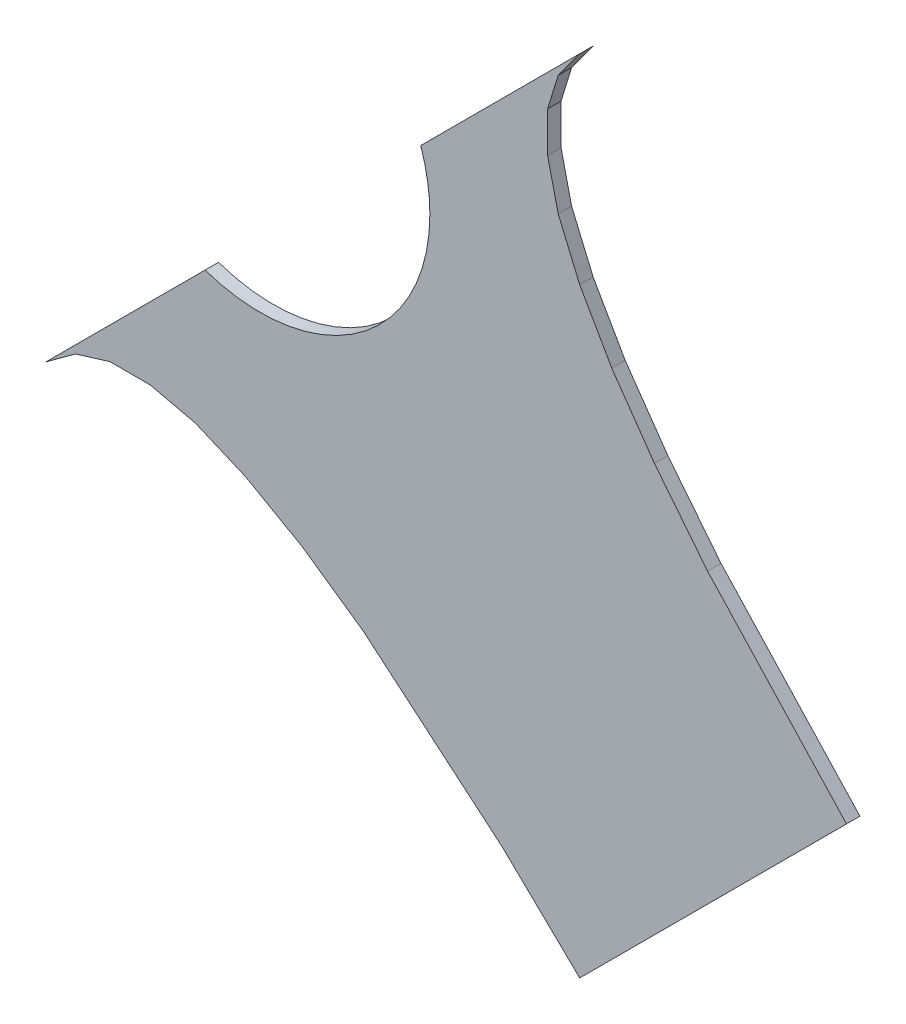
ISO-10303-21;
HEADER;
FILE_DESCRIPTION(('STEP AP214'),'2;1');
FILE_NAME('part.step','',(''),(''),'','','');
FILE_SCHEMA(('AUTOMOTIVE_DESIGN { 1 0 10303 214 1 1 1 1 }'));
ENDSEC;
DATA;
#1=APPLICATION_CONTEXT('core data for automotive mechanical design processes');
#2=APPLICATION_PROTOCOL_DEFINITION('international standard','automotive_design',2000,#1);
#3=PRODUCT_CONTEXT('',#1,'mechanical');
#4=PRODUCT('Part','Part','',(#3));
#5=PRODUCT_RELATED_PRODUCT_CATEGORY('part','',(#4));
#6=PRODUCT_DEFINITION_FORMATION('','',#4);
#7=PRODUCT_DEFINITION_CONTEXT('part definition',#1,'design');
#8=PRODUCT_DEFINITION('design','',#6,#7);
#9=PRODUCT_DEFINITION_SHAPE('','',#8);
#10=(LENGTH_UNIT() NAMED_UNIT(*) SI_UNIT(.MILLI.,.METRE.));
#11=(NAMED_UNIT(*) PLANE_ANGLE_UNIT() SI_UNIT($,.RADIAN.));
#12=(NAMED_UNIT(*) SI_UNIT($,.STERADIAN.) SOLID_ANGLE_UNIT());
#13=UNCERTAINTY_MEASURE_WITH_UNIT(LENGTH_MEASURE(1.E-05),#10,'distance_accuracy_value','');
#14=(GEOMETRIC_REPRESENTATION_CONTEXT(3) GLOBAL_UNCERTAINTY_ASSIGNED_CONTEXT((#13)) GLOBAL_UNIT_ASSIGNED_CONTEXT((#10,
#11,#12)) REPRESENTATION_CONTEXT('',''));
#15=CARTESIAN_POINT('',(0.,0.,0.));
#16=DIRECTION('',(0.,0.,1.));
#17=DIRECTION('',(1.,0.,0.));
#18=AXIS2_PLACEMENT_3D('',#15,#16,#17);
#19=CARTESIAN_POINT('',(46.8470001220703,61.0460014343262,0.));
#20=DIRECTION('',(-0.707104873544097,0.707108688823852,0.));
#21=DIRECTION('',(0.707108688823852,0.707104873544097,0.));
#22=AXIS2_PLACEMENT_3D('',#19,#20,#21);
#23=PLANE('',#22);
#24=DIRECTION('',(0.707108688823852,0.707104873544096,0.));
#25=VECTOR('',#24,1.);
#26=CARTESIAN_POINT('',(46.8470001220703,61.0460014343262,0.03556));
#27=LINE('',#26,#25);
#28=CARTESIAN_POINT('',(46.8470001220703,61.0460014343262,0.03556));
#29=VERTEX_POINT('',#28);
#30=CARTESIAN_POINT('',(47.5540008544922,61.7529983520508,0.03556));
#31=VERTEX_POINT('',#30);
#32=EDGE_CURVE('E11',#29,#31,#27,.T.);
#33=ORIENTED_EDGE('',*,*,#32,.F.);
#34=DIRECTION('',(0.,0.,1.));
#35=VECTOR('',#34,1.);
#36=CARTESIAN_POINT('',(46.8470001220703,61.0460014343262,0.));
#37=LINE('',#36,#35);
#38=CARTESIAN_POINT('',(46.8470001220703,61.0460014343262,0.));
#39=VERTEX_POINT('',#38);
#40=EDGE_CURVE('E24',#39,#29,#37,.T.);
#41=ORIENTED_EDGE('',*,*,#40,.F.);
#42=DIRECTION('',(0.707108688823852,0.707104873544096,0.));
#43=VECTOR('',#42,1.);
#44=CARTESIAN_POINT('',(46.8470001220703,61.0460014343262,0.));
#45=LINE('',#44,#43);
#46=CARTESIAN_POINT('',(47.5540008544922,61.7529983520508,0.));
#47=VERTEX_POINT('',#46);
#48=EDGE_CURVE('E351',#39,#47,#45,.T.);
#49=ORIENTED_EDGE('',*,*,#48,.T.);
#50=DIRECTION('',(0.,0.,1.));
#51=VECTOR('',#50,1.);
#52=CARTESIAN_POINT('',(47.5540008544922,61.7529983520508,0.));
#53=LINE('',#52,#51);
#54=EDGE_CURVE('E37',#47,#31,#53,.T.);
#55=ORIENTED_EDGE('',*,*,#54,.T.);
#56=EDGE_LOOP('',(#33,#41,#49,#55));
#57=FACE_BOUND('',#56,.T.);
#58=ADVANCED_FACE('F17',(#57),#23,.F.);
#59=CARTESIAN_POINT('',(46.6419982910156,61.2439994812012,0.));
#60=DIRECTION('',(0.694712980419731,0.71928706010628,0.));
#61=DIRECTION('',(0.71928706010628,-0.694712980419731,0.));
#62=AXIS2_PLACEMENT_3D('',#59,#60,#61);
#63=PLANE('',#62);
#64=DIRECTION('',(0.71928706010628,-0.694712980419731,0.));
#65=VECTOR('',#64,1.);
#66=CARTESIAN_POINT('',(46.6419982910156,61.2439994812012,0.03556));
#67=LINE('',#66,#65);
#68=CARTESIAN_POINT('',(46.6419982910156,61.2439994812012,0.03556));
#69=VERTEX_POINT('',#68);
#70=EDGE_CURVE('E347',#69,#29,#67,.T.);
#71=ORIENTED_EDGE('',*,*,#70,.F.);
#72=DIRECTION('',(0.,0.,1.));
#73=VECTOR('',#72,1.);
#74=CARTESIAN_POINT('',(46.6419982910156,61.2439994812012,0.));
#75=LINE('',#74,#73);
#76=CARTESIAN_POINT('',(46.6419982910156,61.2439994812012,0.));
#77=VERTEX_POINT('',#76);
#78=EDGE_CURVE('E345',#77,#69,#75,.T.);
#79=ORIENTED_EDGE('',*,*,#78,.F.);
#80=DIRECTION('',(0.71928706010628,-0.694712980419731,0.));
#81=VECTOR('',#80,1.);
#82=CARTESIAN_POINT('',(46.6419982910156,61.2439994812012,0.));
#83=LINE('',#82,#81);
#84=EDGE_CURVE('E343',#77,#39,#83,.T.);
#85=ORIENTED_EDGE('',*,*,#84,.T.);
#86=ORIENTED_EDGE('',*,*,#40,.T.);
#87=EDGE_LOOP('',(#71,#79,#85,#86));
#88=FACE_BOUND('',#87,.T.);
#89=ADVANCED_FACE('F354',(#88),#63,.F.);
#90=CARTESIAN_POINT('',(46.273998260498,61.5550003051758,0.));
#91=DIRECTION('',(0.645477892235465,0.76377895404054,0.));
#92=DIRECTION('',(0.76377895404054,-0.645477892235465,0.));
#93=AXIS2_PLACEMENT_3D('',#90,#91,#92);
#94=PLANE('',#93);
#95=DIRECTION('',(0.76377895404054,-0.645477892235465,0.));
#96=VECTOR('',#95,1.);
#97=CARTESIAN_POINT('',(46.273998260498,61.5550003051758,0.03556));
#98=LINE('',#97,#96);
#99=CARTESIAN_POINT('',(46.273998260498,61.5550003051758,0.03556));
#100=VERTEX_POINT('',#99);
#101=EDGE_CURVE('E340',#100,#69,#98,.T.);
#102=ORIENTED_EDGE('',*,*,#101,.F.);
#103=DIRECTION('',(0.,0.,1.));
#104=VECTOR('',#103,1.);
#105=CARTESIAN_POINT('',(46.273998260498,61.5550003051758,0.));
#106=LINE('',#105,#104);
#107=CARTESIAN_POINT('',(46.273998260498,61.5550003051758,0.));
#108=VERTEX_POINT('',#107);
#109=EDGE_CURVE('E338',#108,#100,#106,.T.);
#110=ORIENTED_EDGE('',*,*,#109,.F.);
#111=DIRECTION('',(0.76377895404054,-0.645477892235465,0.));
#112=VECTOR('',#111,1.);
#113=CARTESIAN_POINT('',(46.273998260498,61.5550003051758,0.));
#114=LINE('',#113,#112);
#115=EDGE_CURVE('E335',#108,#77,#114,.T.);
#116=ORIENTED_EDGE('',*,*,#115,.T.);
#117=ORIENTED_EDGE('',*,*,#78,.T.);
#118=EDGE_LOOP('',(#102,#110,#116,#117));
#119=FACE_BOUND('',#118,.T.);
#120=ADVANCED_FACE('F357',(#119),#94,.F.);
#121=CARTESIAN_POINT('',(46.1119995117188,61.6679992675781,0.));
#122=DIRECTION('',(0.572101838559274,0.820182593278532,0.));
#123=DIRECTION('',(0.820182593278532,-0.572101838559274,0.));
#124=AXIS2_PLACEMENT_3D('',#121,#122,#123);
#125=PLANE('',#124);
#126=DIRECTION('',(0.820182593278532,-0.572101838559274,0.));
#127=VECTOR('',#126,1.);
#128=CARTESIAN_POINT('',(46.1119995117188,61.6679992675781,0.03556));
#129=LINE('',#128,#127);
#130=CARTESIAN_POINT('',(46.1119995117188,61.6679992675781,0.03556));
#131=VERTEX_POINT('',#130);
#132=EDGE_CURVE('E332',#131,#100,#129,.T.);
#133=ORIENTED_EDGE('',*,*,#132,.F.);
#134=DIRECTION('',(0.,0.,1.));
#135=VECTOR('',#134,1.);
#136=CARTESIAN_POINT('',(46.1119995117188,61.6679992675781,0.));
#137=LINE('',#136,#135);
#138=CARTESIAN_POINT('',(46.1119995117188,61.6679992675781,0.));
#139=VERTEX_POINT('',#138);
#140=EDGE_CURVE('E330',#139,#131,#137,.T.);
#141=ORIENTED_EDGE('',*,*,#140,.F.);
#142=DIRECTION('',(0.820182593278532,-0.572101838559274,0.));
#143=VECTOR('',#142,1.);
#144=CARTESIAN_POINT('',(46.1119995117188,61.6679992675781,0.));
#145=LINE('',#144,#143);
#146=EDGE_CURVE('E327',#139,#108,#145,.T.);
#147=ORIENTED_EDGE('',*,*,#146,.T.);
#148=ORIENTED_EDGE('',*,*,#109,.T.);
#149=EDGE_LOOP('',(#133,#141,#147,#148));
#150=FACE_BOUND('',#149,.T.);
#151=ADVANCED_FACE('F362',(#150),#125,.F.);
#152=CARTESIAN_POINT('',(45.9630012512207,61.7529983520508,0.));
#153=DIRECTION('',(0.495511349715486,0.868601463447499,0.));
#154=DIRECTION('',(0.868601463447499,-0.495511349715486,0.));
#155=AXIS2_PLACEMENT_3D('',#152,#153,#154);
#156=PLANE('',#155);
#157=DIRECTION('',(0.868601463447499,-0.495511349715486,0.));
#158=VECTOR('',#157,1.);
#159=CARTESIAN_POINT('',(45.9630012512207,61.7529983520508,0.03556));
#160=LINE('',#159,#158);
#161=CARTESIAN_POINT('',(45.9630012512207,61.7529983520508,0.03556));
#162=VERTEX_POINT('',#161);
#163=EDGE_CURVE('E324',#162,#131,#160,.T.);
#164=ORIENTED_EDGE('',*,*,#163,.F.);
#165=DIRECTION('',(0.,0.,1.));
#166=VECTOR('',#165,1.);
#167=CARTESIAN_POINT('',(45.9630012512207,61.7529983520508,0.));
#168=LINE('',#167,#166);
#169=CARTESIAN_POINT('',(45.9630012512207,61.7529983520508,0.));
#170=VERTEX_POINT('',#169);
#171=EDGE_CURVE('E322',#170,#162,#168,.T.);
#172=ORIENTED_EDGE('',*,*,#171,.F.);
#173=DIRECTION('',(0.868601463447499,-0.495511349715486,0.));
#174=VECTOR('',#173,1.);
#175=CARTESIAN_POINT('',(45.9630012512207,61.7529983520508,0.));
#176=LINE('',#175,#174);
#177=EDGE_CURVE('E319',#170,#139,#176,.T.);
#178=ORIENTED_EDGE('',*,*,#177,.T.);
#179=ORIENTED_EDGE('',*,*,#140,.T.);
#180=EDGE_LOOP('',(#164,#172,#178,#179));
#181=FACE_BOUND('',#180,.T.);
#182=ADVANCED_FACE('F365',(#181),#156,.F.);
#183=CARTESIAN_POINT('',(45.8289985656738,61.810001373291,0.));
#184=DIRECTION('',(0.391442376057666,0.920202622375273,0.));
#185=DIRECTION('',(0.920202622375273,-0.391442376057666,0.));
#186=AXIS2_PLACEMENT_3D('',#183,#184,#185);
#187=PLANE('',#186);
#188=DIRECTION('',(0.920202622375273,-0.391442376057666,0.));
#189=VECTOR('',#188,1.);
#190=CARTESIAN_POINT('',(45.8289985656738,61.810001373291,0.03556));
#191=LINE('',#190,#189);
#192=CARTESIAN_POINT('',(45.8289985656738,61.810001373291,0.03556));
#193=VERTEX_POINT('',#192);
#194=EDGE_CURVE('E316',#193,#162,#191,.T.);
#195=ORIENTED_EDGE('',*,*,#194,.F.);
#196=DIRECTION('',(0.,0.,1.));
#197=VECTOR('',#196,1.);
#198=CARTESIAN_POINT('',(45.8289985656738,61.810001373291,0.));
#199=LINE('',#198,#197);
#200=CARTESIAN_POINT('',(45.8289985656738,61.810001373291,0.));
#201=VERTEX_POINT('',#200);
#202=EDGE_CURVE('E314',#201,#193,#199,.T.);
#203=ORIENTED_EDGE('',*,*,#202,.F.);
#204=DIRECTION('',(0.920202622375273,-0.391442376057666,0.));
#205=VECTOR('',#204,1.);
#206=CARTESIAN_POINT('',(45.8289985656738,61.810001373291,0.));
#207=LINE('',#206,#205);
#208=EDGE_CURVE('E311',#201,#170,#207,.T.);
#209=ORIENTED_EDGE('',*,*,#208,.T.);
#210=ORIENTED_EDGE('',*,*,#171,.T.);
#211=EDGE_LOOP('',(#195,#203,#209,#210));
#212=FACE_BOUND('',#211,.T.);
#213=ADVANCED_FACE('F370',(#212),#187,.F.);
#214=CARTESIAN_POINT('',(45.7089996337891,61.8380012512207,0.));
#215=DIRECTION('',(0.227230594252667,0.973840981390483,0.));
#216=DIRECTION('',(0.973840981390483,-0.227230594252667,0.));
#217=AXIS2_PLACEMENT_3D('',#214,#215,#216);
#218=PLANE('',#217);
#219=DIRECTION('',(0.973840981390483,-0.227230594252667,0.));
#220=VECTOR('',#219,1.);
#221=CARTESIAN_POINT('',(45.7089996337891,61.8380012512207,0.03556));
#222=LINE('',#221,#220);
#223=CARTESIAN_POINT('',(45.7089996337891,61.8380012512207,0.03556));
#224=VERTEX_POINT('',#223);
#225=EDGE_CURVE('E308',#224,#193,#222,.T.);
#226=ORIENTED_EDGE('',*,*,#225,.F.);
#227=DIRECTION('',(0.,0.,1.));
#228=VECTOR('',#227,1.);
#229=CARTESIAN_POINT('',(45.7089996337891,61.8380012512207,0.));
#230=LINE('',#229,#228);
#231=CARTESIAN_POINT('',(45.7089996337891,61.8380012512207,0.));
#232=VERTEX_POINT('',#231);
#233=EDGE_CURVE('E306',#232,#224,#230,.T.);
#234=ORIENTED_EDGE('',*,*,#233,.F.);
#235=DIRECTION('',(0.973840981390483,-0.227230594252667,0.));
#236=VECTOR('',#235,1.);
#237=CARTESIAN_POINT('',(45.7089996337891,61.8380012512207,0.));
#238=LINE('',#237,#236);
#239=EDGE_CURVE('E303',#232,#201,#238,.T.);
#240=ORIENTED_EDGE('',*,*,#239,.T.);
#241=ORIENTED_EDGE('',*,*,#202,.T.);
#242=EDGE_LOOP('',(#226,#234,#240,#241));
#243=FACE_BOUND('',#242,.T.);
#244=ADVANCED_FACE('F373',(#243),#218,.F.);
#245=CARTESIAN_POINT('',(45.6020011901855,61.8380012512207,0.));
#246=DIRECTION('',(0.,1.,0.));
#247=DIRECTION('',(1.,0.,0.));
#248=AXIS2_PLACEMENT_3D('',#245,#246,#247);
#249=PLANE('',#248);
#250=DIRECTION('',(1.,0.,0.));
#251=VECTOR('',#250,1.);
#252=CARTESIAN_POINT('',(45.6020011901855,61.8380012512207,0.03556));
#253=LINE('',#252,#251);
#254=CARTESIAN_POINT('',(45.6020011901855,61.8380012512207,0.03556));
#255=VERTEX_POINT('',#254);
#256=EDGE_CURVE('E300',#255,#224,#253,.T.);
#257=ORIENTED_EDGE('',*,*,#256,.F.);
#258=DIRECTION('',(0.,0.,1.));
#259=VECTOR('',#258,1.);
#260=CARTESIAN_POINT('',(45.6020011901855,61.8380012512207,0.));
#261=LINE('',#260,#259);
#262=CARTESIAN_POINT('',(45.6020011901855,61.8380012512207,0.));
#263=VERTEX_POINT('',#262);
#264=EDGE_CURVE('E298',#263,#255,#261,.T.);
#265=ORIENTED_EDGE('',*,*,#264,.F.);
#266=DIRECTION('',(1.,0.,0.));
#267=VECTOR('',#266,1.);
#268=CARTESIAN_POINT('',(45.6020011901855,61.8380012512207,0.));
#269=LINE('',#268,#267);
#270=EDGE_CURVE('E295',#263,#232,#269,.T.);
#271=ORIENTED_EDGE('',*,*,#270,.T.);
#272=ORIENTED_EDGE('',*,*,#233,.T.);
#273=EDGE_LOOP('',(#257,#265,#271,#272));
#274=FACE_BOUND('',#273,.T.);
#275=ADVANCED_FACE('F378',(#274),#249,.F.);
#276=CARTESIAN_POINT('',(45.5110015869141,61.810001373291,0.));
#277=DIRECTION('',(-0.294085848837523,0.95577900872195,0.));
#278=DIRECTION('',(0.95577900872195,0.294085848837523,0.));
#279=AXIS2_PLACEMENT_3D('',#276,#277,#278);
#280=PLANE('',#279);
#281=DIRECTION('',(0.95577900872195,0.294085848837523,0.));
#282=VECTOR('',#281,1.);
#283=CARTESIAN_POINT('',(45.5110015869141,61.810001373291,0.03556));
#284=LINE('',#283,#282);
#285=CARTESIAN_POINT('',(45.5110015869141,61.810001373291,0.03556));
#286=VERTEX_POINT('',#285);
#287=EDGE_CURVE('E292',#286,#255,#284,.T.);
#288=ORIENTED_EDGE('',*,*,#287,.F.);
#289=DIRECTION('',(0.,0.,1.));
#290=VECTOR('',#289,1.);
#291=CARTESIAN_POINT('',(45.5110015869141,61.810001373291,0.));
#292=LINE('',#291,#290);
#293=CARTESIAN_POINT('',(45.5110015869141,61.810001373291,0.));
#294=VERTEX_POINT('',#293);
#295=EDGE_CURVE('E290',#294,#286,#292,.T.);
#296=ORIENTED_EDGE('',*,*,#295,.F.);
#297=DIRECTION('',(0.95577900872195,0.294085848837523,0.));
#298=VECTOR('',#297,1.);
#299=CARTESIAN_POINT('',(45.5110015869141,61.810001373291,0.));
#300=LINE('',#299,#298);
#301=EDGE_CURVE('E287',#294,#263,#300,.T.);
#302=ORIENTED_EDGE('',*,*,#301,.T.);
#303=ORIENTED_EDGE('',*,*,#264,.T.);
#304=EDGE_LOOP('',(#288,#296,#302,#303));
#305=FACE_BOUND('',#304,.T.);
#306=ADVANCED_FACE('F381',(#305),#280,.F.);
#307=CARTESIAN_POINT('',(45.4329986572266,61.7529983520508,0.));
#308=DIRECTION('',(-0.590022529192244,0.807386781564813,0.));
#309=DIRECTION('',(0.807386781564813,0.590022529192244,0.));
#310=AXIS2_PLACEMENT_3D('',#307,#308,#309);
#311=PLANE('',#310);
#312=DIRECTION('',(0.807386781564813,0.590022529192244,0.));
#313=VECTOR('',#312,1.);
#314=CARTESIAN_POINT('',(45.4329986572266,61.7529983520508,0.03556));
#315=LINE('',#314,#313);
#316=CARTESIAN_POINT('',(45.4329986572266,61.7529983520508,0.03556));
#317=VERTEX_POINT('',#316);
#318=EDGE_CURVE('E284',#317,#286,#315,.T.);
#319=ORIENTED_EDGE('',*,*,#318,.F.);
#320=DIRECTION('',(0.,0.,1.));
#321=VECTOR('',#320,1.);
#322=CARTESIAN_POINT('',(45.4329986572266,61.7529983520508,0.));
#323=LINE('',#322,#321);
#324=CARTESIAN_POINT('',(45.4329986572266,61.7529983520508,0.));
#325=VERTEX_POINT('',#324);
#326=EDGE_CURVE('E282',#325,#317,#323,.T.);
#327=ORIENTED_EDGE('',*,*,#326,.F.);
#328=DIRECTION('',(0.807386781564813,0.590022529192244,0.));
#329=VECTOR('',#328,1.);
#330=CARTESIAN_POINT('',(45.4329986572266,61.7529983520508,0.));
#331=LINE('',#330,#329);
#332=EDGE_CURVE('E279',#325,#294,#331,.T.);
#333=ORIENTED_EDGE('',*,*,#332,.T.);
#334=ORIENTED_EDGE('',*,*,#295,.T.);
#335=EDGE_LOOP('',(#319,#327,#333,#334));
#336=FACE_BOUND('',#335,.T.);
#337=ADVANCED_FACE('F386',(#336),#311,.F.);
#338=CARTESIAN_POINT('',(45.8542411622094,62.1742408570336,0.));
#339=DIRECTION('',(0.707106781186548,-0.707106781186548,0.));
#340=DIRECTION('',(-0.707106781186548,-0.707106781186548,0.));
#341=AXIS2_PLACEMENT_3D('',#338,#339,#340);
#342=PLANE('',#341);
#343=DIRECTION('',(-0.707106781186548,-0.707106781186548,0.));
#344=VECTOR('',#343,1.);
#345=CARTESIAN_POINT('',(46.8470001220703,63.1669998168945,0.03556));
#346=LINE('',#345,#344);
#347=CARTESIAN_POINT('',(45.8542411622094,62.1742408570336,0.03556));
#348=VERTEX_POINT('',#347);
#349=EDGE_CURVE('E276',#348,#317,#346,.T.);
#350=ORIENTED_EDGE('',*,*,#349,.F.);
#351=DIRECTION('',(0.,0.,1.));
#352=VECTOR('',#351,1.);
#353=CARTESIAN_POINT('',(45.8542411622094,62.1742408570336,0.));
#354=LINE('',#353,#352);
#355=CARTESIAN_POINT('',(45.8542411622094,62.1742408570336,0.));
#356=VERTEX_POINT('',#355);
#357=EDGE_CURVE('E274',#356,#348,#354,.T.);
#358=ORIENTED_EDGE('',*,*,#357,.F.);
#359=DIRECTION('',(-0.707106781186548,-0.707106781186548,0.));
#360=VECTOR('',#359,1.);
#361=CARTESIAN_POINT('',(46.8470001220703,63.1669998168945,0.));
#362=LINE('',#361,#360);
#363=EDGE_CURVE('E271',#356,#325,#362,.T.);
#364=ORIENTED_EDGE('',*,*,#363,.T.);
#365=ORIENTED_EDGE('',*,*,#326,.T.);
#366=EDGE_LOOP('',(#350,#358,#364,#365));
#367=FACE_BOUND('',#366,.T.);
#368=ADVANCED_FACE('F389',(#367),#342,.F.);
#369=CARTESIAN_POINT('',(46.0000096,62.5999764,0.));
#370=DIRECTION('',(0.,0.,-1.));
#371=DIRECTION('',(1.,0.,0.));
#372=AXIS2_PLACEMENT_3D('',#369,#370,#371);
#373=CYLINDRICAL_SURFACE('',#372,0.4499991);
#374=ORIENTED_EDGE('',*,*,#357,.T.);
#375=CARTESIAN_POINT('',(46.0000096,62.5999764,0.03556));
#376=DIRECTION('',(0.,0.,1.));
#377=DIRECTION('',(1.,0.,0.));
#378=AXIS2_PLACEMENT_3D('',#375,#376,#377);
#379=CIRCLE('',#378,0.4499991);
#380=CARTESIAN_POINT('',(46.4500087,62.5999764,0.03556));
#381=VERTEX_POINT('',#380);
#382=EDGE_CURVE('E268',#348,#381,#379,.T.);
#383=ORIENTED_EDGE('',*,*,#382,.T.);
#384=DIRECTION('',(0.,0.,1.));
#385=VECTOR('',#384,1.);
#386=CARTESIAN_POINT('',(46.4500087,62.5999764,0.));
#387=LINE('',#386,#385);
#388=CARTESIAN_POINT('',(46.4500087,62.5999764,0.));
#389=VERTEX_POINT('',#388);
#390=EDGE_CURVE('E266',#389,#381,#387,.T.);
#391=ORIENTED_EDGE('',*,*,#390,.F.);
#392=CARTESIAN_POINT('',(46.0000096,62.5999764,0.));
#393=DIRECTION('',(0.,0.,1.));
#394=DIRECTION('',(1.,0.,0.));
#395=AXIS2_PLACEMENT_3D('',#392,#393,#394);
#396=CIRCLE('',#395,0.4499991);
#397=EDGE_CURVE('E263',#356,#389,#396,.T.);
#398=ORIENTED_EDGE('',*,*,#397,.F.);
#399=EDGE_LOOP('',(#374,#383,#391,#398));
#400=FACE_BOUND('',#399,.T.);
#401=ADVANCED_FACE('F395',(#400),#373,.F.);
#402=CARTESIAN_POINT('',(46.0000096,62.5999764,0.));
#403=DIRECTION('',(0.,0.,-1.));
#404=DIRECTION('',(1.,0.,0.));
#405=AXIS2_PLACEMENT_3D('',#402,#403,#404);
#406=CYLINDRICAL_SURFACE('',#405,0.4499991);
#407=ORIENTED_EDGE('',*,*,#390,.T.);
#408=CARTESIAN_POINT('',(46.0000096,62.5999764,0.03556));
#409=DIRECTION('',(0.,0.,1.));
#410=DIRECTION('',(1.,0.,0.));
#411=AXIS2_PLACEMENT_3D('',#408,#409,#410);
#412=CIRCLE('',#411,0.4499991);
#413=CARTESIAN_POINT('',(46.4257451429664,62.7457448377906,0.03556));
#414=VERTEX_POINT('',#413);
#415=EDGE_CURVE('E260',#381,#414,#412,.T.);
#416=ORIENTED_EDGE('',*,*,#415,.T.);
#417=DIRECTION('',(0.,0.,1.));
#418=VECTOR('',#417,1.);
#419=CARTESIAN_POINT('',(46.4257451429664,62.7457448377906,0.));
#420=LINE('',#419,#418);
#421=CARTESIAN_POINT('',(46.4257451429664,62.7457448377906,0.));
#422=VERTEX_POINT('',#421);
#423=EDGE_CURVE('E258',#422,#414,#420,.T.);
#424=ORIENTED_EDGE('',*,*,#423,.F.);
#425=EDGE_CURVE('E257',#389,#422,#396,.T.);
#426=ORIENTED_EDGE('',*,*,#425,.F.);
#427=EDGE_LOOP('',(#407,#416,#424,#426));
#428=FACE_BOUND('',#427,.T.);
#429=ADVANCED_FACE('F398',(#428),#406,.F.);
#430=CARTESIAN_POINT('',(46.8470001220703,63.1669998168945,0.));
#431=DIRECTION('',(0.707106781186548,-0.707106781186548,0.));
#432=DIRECTION('',(-0.707106781186548,-0.707106781186548,0.));
#433=AXIS2_PLACEMENT_3D('',#430,#431,#432);
#434=PLANE('',#433);
#435=DIRECTION('',(-0.707106781186548,-0.707106781186548,0.));
#436=VECTOR('',#435,1.);
#437=CARTESIAN_POINT('',(46.8470001220703,63.1669998168945,0.03556));
#438=LINE('',#437,#436);
#439=CARTESIAN_POINT('',(46.8470001220703,63.1669998168945,0.03556));
#440=VERTEX_POINT('',#439);
#441=EDGE_CURVE('E254',#440,#414,#438,.T.);
#442=ORIENTED_EDGE('',*,*,#441,.F.);
#443=DIRECTION('',(0.,0.,1.));
#444=VECTOR('',#443,1.);
#445=CARTESIAN_POINT('',(46.8470001220703,63.1669998168945,0.));
#446=LINE('',#445,#444);
#447=CARTESIAN_POINT('',(46.8470001220703,63.1669998168945,0.));
#448=VERTEX_POINT('',#447);
#449=EDGE_CURVE('E252',#448,#440,#446,.T.);
#450=ORIENTED_EDGE('',*,*,#449,.F.);
#451=EDGE_CURVE('E251',#448,#422,#362,.T.);
#452=ORIENTED_EDGE('',*,*,#451,.T.);
#453=ORIENTED_EDGE('',*,*,#423,.T.);
#454=EDGE_LOOP('',(#442,#450,#452,#453));
#455=FACE_BOUND('',#454,.T.);
#456=ADVANCED_FACE('F404',(#455),#434,.F.);
#457=CARTESIAN_POINT('',(46.7900009155274,63.0890007019043,0.));
#458=DIRECTION('',(-0.807391845742416,0.59001559930959,0.));
#459=DIRECTION('',(0.59001559930959,0.807391845742416,0.));
#460=AXIS2_PLACEMENT_3D('',#457,#458,#459);
#461=PLANE('',#460);
#462=DIRECTION('',(0.59001559930959,0.807391845742416,0.));
#463=VECTOR('',#462,1.);
#464=CARTESIAN_POINT('',(46.7900009155274,63.0890007019043,0.03556));
#465=LINE('',#464,#463);
#466=CARTESIAN_POINT('',(46.7900009155274,63.0890007019043,0.03556));
#467=VERTEX_POINT('',#466);
#468=EDGE_CURVE('E248',#467,#440,#465,.T.);
#469=ORIENTED_EDGE('',*,*,#468,.F.);
#470=DIRECTION('',(0.,0.,1.));
#471=VECTOR('',#470,1.);
#472=CARTESIAN_POINT('',(46.7900009155274,63.0890007019043,0.));
#473=LINE('',#472,#471);
#474=CARTESIAN_POINT('',(46.7900009155274,63.0890007019043,0.));
#475=VERTEX_POINT('',#474);
#476=EDGE_CURVE('E246',#475,#467,#473,.T.);
#477=ORIENTED_EDGE('',*,*,#476,.F.);
#478=DIRECTION('',(0.59001559930959,0.807391845742416,0.));
#479=VECTOR('',#478,1.);
#480=CARTESIAN_POINT('',(46.7900009155274,63.0890007019043,0.));
#481=LINE('',#480,#479);
#482=EDGE_CURVE('E243',#475,#448,#481,.T.);
#483=ORIENTED_EDGE('',*,*,#482,.T.);
#484=ORIENTED_EDGE('',*,*,#449,.T.);
#485=EDGE_LOOP('',(#469,#477,#483,#484));
#486=FACE_BOUND('',#485,.T.);
#487=ADVANCED_FACE('F407',(#486),#461,.F.);
#488=CARTESIAN_POINT('',(46.7620010375977,62.9980010986328,0.));
#489=DIRECTION('',(-0.95577900872195,0.294085848837523,0.));
#490=DIRECTION('',(0.294085848837523,0.95577900872195,0.));
#491=AXIS2_PLACEMENT_3D('',#488,#489,#490);
#492=PLANE('',#491);
#493=DIRECTION('',(0.294085848837523,0.95577900872195,0.));
#494=VECTOR('',#493,1.);
#495=CARTESIAN_POINT('',(46.7620010375977,62.9980010986328,0.03556));
#496=LINE('',#495,#494);
#497=CARTESIAN_POINT('',(46.7620010375977,62.9980010986328,0.03556));
#498=VERTEX_POINT('',#497);
#499=EDGE_CURVE('E240',#498,#467,#496,.T.);
#500=ORIENTED_EDGE('',*,*,#499,.F.);
#501=DIRECTION('',(0.,0.,1.));
#502=VECTOR('',#501,1.);
#503=CARTESIAN_POINT('',(46.7620010375977,62.9980010986328,0.));
#504=LINE('',#503,#502);
#505=CARTESIAN_POINT('',(46.7620010375977,62.9980010986328,0.));
#506=VERTEX_POINT('',#505);
#507=EDGE_CURVE('E238',#506,#498,#504,.T.);
#508=ORIENTED_EDGE('',*,*,#507,.F.);
#509=DIRECTION('',(0.294085848837523,0.95577900872195,0.));
#510=VECTOR('',#509,1.);
#511=CARTESIAN_POINT('',(46.7620010375977,62.9980010986328,0.));
#512=LINE('',#511,#510);
#513=EDGE_CURVE('E235',#506,#475,#512,.T.);
#514=ORIENTED_EDGE('',*,*,#513,.T.);
#515=ORIENTED_EDGE('',*,*,#476,.T.);
#516=EDGE_LOOP('',(#500,#508,#514,#515));
#517=FACE_BOUND('',#516,.T.);
#518=ADVANCED_FACE('F412',(#517),#492,.F.);
#519=CARTESIAN_POINT('',(46.7620010375977,62.890998840332,0.));
#520=DIRECTION('',(-1.,0.,0.));
#521=DIRECTION('',(0.,1.,0.));
#522=AXIS2_PLACEMENT_3D('',#519,#520,#521);
#523=PLANE('',#522);
#524=DIRECTION('',(0.,1.,0.));
#525=VECTOR('',#524,1.);
#526=CARTESIAN_POINT('',(46.7620010375977,62.890998840332,0.03556));
#527=LINE('',#526,#525);
#528=CARTESIAN_POINT('',(46.7620010375977,62.890998840332,0.03556));
#529=VERTEX_POINT('',#528);
#530=EDGE_CURVE('E232',#529,#498,#527,.T.);
#531=ORIENTED_EDGE('',*,*,#530,.F.);
#532=DIRECTION('',(0.,0.,1.));
#533=VECTOR('',#532,1.);
#534=CARTESIAN_POINT('',(46.7620010375977,62.890998840332,0.));
#535=LINE('',#534,#533);
#536=CARTESIAN_POINT('',(46.7620010375977,62.890998840332,0.));
#537=VERTEX_POINT('',#536);
#538=EDGE_CURVE('E230',#537,#529,#535,.T.);
#539=ORIENTED_EDGE('',*,*,#538,.F.);
#540=DIRECTION('',(0.,1.,0.));
#541=VECTOR('',#540,1.);
#542=CARTESIAN_POINT('',(46.7620010375977,62.890998840332,0.));
#543=LINE('',#542,#541);
#544=EDGE_CURVE('E227',#537,#506,#543,.T.);
#545=ORIENTED_EDGE('',*,*,#544,.T.);
#546=ORIENTED_EDGE('',*,*,#507,.T.);
#547=EDGE_LOOP('',(#531,#539,#545,#546));
#548=FACE_BOUND('',#547,.T.);
#549=ADVANCED_FACE('F415',(#548),#523,.F.);
#550=CARTESIAN_POINT('',(46.7900009155274,62.7709999084473,0.));
#551=DIRECTION('',(-0.973840981390483,-0.227230594252667,0.));
#552=DIRECTION('',(-0.227230594252667,0.973840981390483,0.));
#553=AXIS2_PLACEMENT_3D('',#550,#551,#552);
#554=PLANE('',#553);
#555=DIRECTION('',(-0.227230594252667,0.973840981390483,0.));
#556=VECTOR('',#555,1.);
#557=CARTESIAN_POINT('',(46.7900009155274,62.7709999084473,0.03556));
#558=LINE('',#557,#556);
#559=CARTESIAN_POINT('',(46.7900009155274,62.7709999084473,0.03556));
#560=VERTEX_POINT('',#559);
#561=EDGE_CURVE('E224',#560,#529,#558,.T.);
#562=ORIENTED_EDGE('',*,*,#561,.F.);
#563=DIRECTION('',(0.,0.,1.));
#564=VECTOR('',#563,1.);
#565=CARTESIAN_POINT('',(46.7900009155274,62.7709999084473,0.));
#566=LINE('',#565,#564);
#567=CARTESIAN_POINT('',(46.7900009155274,62.7709999084473,0.));
#568=VERTEX_POINT('',#567);
#569=EDGE_CURVE('E222',#568,#560,#566,.T.);
#570=ORIENTED_EDGE('',*,*,#569,.F.);
#571=DIRECTION('',(-0.227230594252667,0.973840981390483,0.));
#572=VECTOR('',#571,1.);
#573=CARTESIAN_POINT('',(46.7900009155274,62.7709999084473,0.));
#574=LINE('',#573,#572);
#575=EDGE_CURVE('E219',#568,#537,#574,.T.);
#576=ORIENTED_EDGE('',*,*,#575,.T.);
#577=ORIENTED_EDGE('',*,*,#538,.T.);
#578=EDGE_LOOP('',(#562,#570,#576,#577));
#579=FACE_BOUND('',#578,.T.);
#580=ADVANCED_FACE('F420',(#579),#554,.F.);
#581=CARTESIAN_POINT('',(46.8470001220703,62.6370010375977,0.));
#582=DIRECTION('',(-0.920208044437893,-0.391429629629373,0.));
#583=DIRECTION('',(-0.391429629629373,0.920208044437893,0.));
#584=AXIS2_PLACEMENT_3D('',#581,#582,#583);
#585=PLANE('',#584);
#586=DIRECTION('',(-0.391429629629373,0.920208044437893,0.));
#587=VECTOR('',#586,1.);
#588=CARTESIAN_POINT('',(46.8470001220703,62.6370010375977,0.03556));
#589=LINE('',#588,#587);
#590=CARTESIAN_POINT('',(46.8470001220703,62.6370010375977,0.03556));
#591=VERTEX_POINT('',#590);
#592=EDGE_CURVE('E216',#591,#560,#589,.T.);
#593=ORIENTED_EDGE('',*,*,#592,.F.);
#594=DIRECTION('',(0.,0.,1.));
#595=VECTOR('',#594,1.);
#596=CARTESIAN_POINT('',(46.8470001220703,62.6370010375977,0.));
#597=LINE('',#596,#595);
#598=CARTESIAN_POINT('',(46.8470001220703,62.6370010375977,0.));
#599=VERTEX_POINT('',#598);
#600=EDGE_CURVE('E214',#599,#591,#597,.T.);
#601=ORIENTED_EDGE('',*,*,#600,.F.);
#602=DIRECTION('',(-0.391429629629373,0.920208044437893,0.));
#603=VECTOR('',#602,1.);
#604=CARTESIAN_POINT('',(46.8470001220703,62.6370010375977,0.));
#605=LINE('',#604,#603);
#606=EDGE_CURVE('E211',#599,#568,#605,.T.);
#607=ORIENTED_EDGE('',*,*,#606,.T.);
#608=ORIENTED_EDGE('',*,*,#569,.T.);
#609=EDGE_LOOP('',(#593,#601,#607,#608));
#610=FACE_BOUND('',#609,.T.);
#611=ADVANCED_FACE('F423',(#610),#585,.F.);
#612=CARTESIAN_POINT('',(46.931999206543,62.4879989624024,0.));
#613=DIRECTION('',(-0.868606923465397,-0.495501778511418,0.));
#614=DIRECTION('',(-0.495501778511418,0.868606923465397,0.));
#615=AXIS2_PLACEMENT_3D('',#612,#613,#614);
#616=PLANE('',#615);
#617=DIRECTION('',(-0.495501778511418,0.868606923465397,0.));
#618=VECTOR('',#617,1.);
#619=CARTESIAN_POINT('',(46.931999206543,62.4879989624023,0.03556));
#620=LINE('',#619,#618);
#621=CARTESIAN_POINT('',(46.931999206543,62.4879989624023,0.03556));
#622=VERTEX_POINT('',#621);
#623=EDGE_CURVE('E208',#622,#591,#620,.T.);
#624=ORIENTED_EDGE('',*,*,#623,.F.);
#625=DIRECTION('',(0.,0.,1.));
#626=VECTOR('',#625,1.);
#627=CARTESIAN_POINT('',(46.931999206543,62.4879989624023,0.));
#628=LINE('',#627,#626);
#629=CARTESIAN_POINT('',(46.931999206543,62.4879989624023,0.));
#630=VERTEX_POINT('',#629);
#631=EDGE_CURVE('E206',#630,#622,#628,.T.);
#632=ORIENTED_EDGE('',*,*,#631,.F.);
#633=DIRECTION('',(-0.495501778511418,0.868606923465397,0.));
#634=VECTOR('',#633,1.);
#635=CARTESIAN_POINT('',(46.931999206543,62.4879989624023,0.));
#636=LINE('',#635,#634);
#637=EDGE_CURVE('E203',#630,#599,#636,.T.);
#638=ORIENTED_EDGE('',*,*,#637,.T.);
#639=ORIENTED_EDGE('',*,*,#600,.T.);
#640=EDGE_LOOP('',(#624,#632,#638,#639));
#641=FACE_BOUND('',#640,.T.);
#642=ADVANCED_FACE('F426',(#641),#616,.F.);
#643=CARTESIAN_POINT('',(47.0449981689453,62.326000213623,0.));
#644=DIRECTION('',(-0.820182593278532,-0.572101838559274,0.));
#645=DIRECTION('',(-0.572101838559274,0.820182593278532,0.));
#646=AXIS2_PLACEMENT_3D('',#643,#644,#645);
#647=PLANE('',#646);
#648=DIRECTION('',(-0.572101838559274,0.820182593278532,0.));
#649=VECTOR('',#648,1.);
#650=CARTESIAN_POINT('',(47.0449981689453,62.326000213623,0.03556));
#651=LINE('',#650,#649);
#652=CARTESIAN_POINT('',(47.0449981689453,62.326000213623,0.03556));
#653=VERTEX_POINT('',#652);
#654=EDGE_CURVE('E200',#653,#622,#651,.T.);
#655=ORIENTED_EDGE('',*,*,#654,.F.);
#656=DIRECTION('',(0.,0.,1.));
#657=VECTOR('',#656,1.);
#658=CARTESIAN_POINT('',(47.0449981689453,62.326000213623,0.));
#659=LINE('',#658,#657);
#660=CARTESIAN_POINT('',(47.0449981689453,62.326000213623,0.));
#661=VERTEX_POINT('',#660);
#662=EDGE_CURVE('E198',#661,#653,#659,.T.);
#663=ORIENTED_EDGE('',*,*,#662,.F.);
#664=DIRECTION('',(-0.572101838559274,0.820182593278532,0.));
#665=VECTOR('',#664,1.);
#666=CARTESIAN_POINT('',(47.0449981689453,62.326000213623,0.));
#667=LINE('',#666,#665);
#668=EDGE_CURVE('E189',#661,#630,#667,.T.);
#669=ORIENTED_EDGE('',*,*,#668,.T.);
#670=ORIENTED_EDGE('',*,*,#631,.T.);
#671=EDGE_LOOP('',(#655,#663,#669,#670));
#672=FACE_BOUND('',#671,.T.);
#673=ADVANCED_FACE('F429',(#672),#647,.F.);
#674=CARTESIAN_POINT('',(47.1860008239746,62.1489982604981,0.));
#675=DIRECTION('',(-0.782158130480178,-0.623079977951268,0.));
#676=DIRECTION('',(-0.623079977951268,0.782158130480178,0.));
#677=AXIS2_PLACEMENT_3D('',#674,#675,#676);
#678=PLANE('',#677);
#679=DIRECTION('',(-0.623079977951268,0.782158130480178,0.));
#680=VECTOR('',#679,1.);
#681=CARTESIAN_POINT('',(47.1860008239746,62.148998260498,0.03556));
#682=LINE('',#681,#680);
#683=CARTESIAN_POINT('',(47.1860008239746,62.148998260498,0.03556));
#684=VERTEX_POINT('',#683);
#685=EDGE_CURVE('E175',#684,#653,#682,.T.);
#686=ORIENTED_EDGE('',*,*,#685,.F.);
#687=DIRECTION('',(0.,0.,1.));
#688=VECTOR('',#687,1.);
#689=CARTESIAN_POINT('',(47.1860008239746,62.148998260498,0.));
#690=LINE('',#689,#688);
#691=CARTESIAN_POINT('',(47.1860008239746,62.148998260498,0.));
#692=VERTEX_POINT('',#691);
#693=EDGE_CURVE('E170',#692,#684,#690,.T.);
#694=ORIENTED_EDGE('',*,*,#693,.F.);
#695=DIRECTION('',(-0.623079977951268,0.782158130480178,0.));
#696=VECTOR('',#695,1.);
#697=CARTESIAN_POINT('',(47.1860008239746,62.148998260498,0.));
#698=LINE('',#697,#696);
#699=EDGE_CURVE('E173',#692,#661,#698,.T.);
#700=ORIENTED_EDGE('',*,*,#699,.T.);
#701=ORIENTED_EDGE('',*,*,#662,.T.);
#702=EDGE_LOOP('',(#686,#694,#700,#701));
#703=FACE_BOUND('',#702,.T.);
#704=ADVANCED_FACE('F172',(#703),#678,.F.);
#705=CARTESIAN_POINT('',(47.5540008544922,61.7529983520508,0.));
#706=DIRECTION('',(-0.732529793612581,-0.680734971534377,0.));
#707=DIRECTION('',(-0.680734971534377,0.732529793612581,0.));
#708=AXIS2_PLACEMENT_3D('',#705,#706,#707);
#709=PLANE('',#708);
#710=DIRECTION('',(-0.680734971534377,0.732529793612581,0.));
#711=VECTOR('',#710,1.);
#712=CARTESIAN_POINT('',(47.5540008544922,61.7529983520508,0.03556));
#713=LINE('',#712,#711);
#714=EDGE_CURVE('E190',#31,#684,#713,.T.);
#715=ORIENTED_EDGE('',*,*,#714,.F.);
#716=ORIENTED_EDGE('',*,*,#54,.F.);
#717=DIRECTION('',(-0.680734971534377,0.732529793612581,0.));
#718=VECTOR('',#717,1.);
#719=CARTESIAN_POINT('',(47.5540008544922,61.7529983520508,0.));
#720=LINE('',#719,#718);
#721=EDGE_CURVE('E186',#47,#692,#720,.T.);
#722=ORIENTED_EDGE('',*,*,#721,.T.);
#723=ORIENTED_EDGE('',*,*,#693,.T.);
#724=EDGE_LOOP('',(#715,#716,#722,#723));
#725=FACE_BOUND('',#724,.T.);
#726=ADVANCED_FACE('F192',(#725),#709,.F.);
#727=CARTESIAN_POINT('',(47.5540008544922,61.7529983520508,0.));
#728=DIRECTION('',(0.,0.,1.));
#729=DIRECTION('',(1.,0.,0.));
#730=AXIS2_PLACEMENT_3D('',#727,#728,#729);
#731=PLANE('',#730);
#732=ORIENTED_EDGE('',*,*,#721,.F.);
#733=ORIENTED_EDGE('',*,*,#48,.F.);
#734=ORIENTED_EDGE('',*,*,#84,.F.);
#735=ORIENTED_EDGE('',*,*,#115,.F.);
#736=ORIENTED_EDGE('',*,*,#146,.F.);
#737=ORIENTED_EDGE('',*,*,#177,.F.);
#738=ORIENTED_EDGE('',*,*,#208,.F.);
#739=ORIENTED_EDGE('',*,*,#239,.F.);
#740=ORIENTED_EDGE('',*,*,#270,.F.);
#741=ORIENTED_EDGE('',*,*,#301,.F.);
#742=ORIENTED_EDGE('',*,*,#332,.F.);
#743=ORIENTED_EDGE('',*,*,#363,.F.);
#744=ORIENTED_EDGE('',*,*,#397,.T.);
#745=ORIENTED_EDGE('',*,*,#425,.T.);
#746=ORIENTED_EDGE('',*,*,#451,.F.);
#747=ORIENTED_EDGE('',*,*,#482,.F.);
#748=ORIENTED_EDGE('',*,*,#513,.F.);
#749=ORIENTED_EDGE('',*,*,#544,.F.);
#750=ORIENTED_EDGE('',*,*,#575,.F.);
#751=ORIENTED_EDGE('',*,*,#606,.F.);
#752=ORIENTED_EDGE('',*,*,#637,.F.);
#753=ORIENTED_EDGE('',*,*,#668,.F.);
#754=ORIENTED_EDGE('',*,*,#699,.F.);
#755=EDGE_LOOP('',(#732,#733,#734,#735,#736,#737,#738,#739,#740,#741,#742,#743,#744,#745,#746,
#747,#748,#749,#750,#751,#752,#753,#754));
#756=FACE_BOUND('',#755,.T.);
#757=ADVANCED_FACE('F184',(#756),#731,.F.);
#758=CARTESIAN_POINT('',(47.5540008544922,61.7529983520508,0.03556));
#759=DIRECTION('',(0.,0.,1.));
#760=DIRECTION('',(1.,0.,0.));
#761=AXIS2_PLACEMENT_3D('',#758,#759,#760);
#762=PLANE('',#761);
#763=ORIENTED_EDGE('',*,*,#32,.T.);
#764=ORIENTED_EDGE('',*,*,#714,.T.);
#765=ORIENTED_EDGE('',*,*,#685,.T.);
#766=ORIENTED_EDGE('',*,*,#654,.T.);
#767=ORIENTED_EDGE('',*,*,#623,.T.);
#768=ORIENTED_EDGE('',*,*,#592,.T.);
#769=ORIENTED_EDGE('',*,*,#561,.T.);
#770=ORIENTED_EDGE('',*,*,#530,.T.);
#771=ORIENTED_EDGE('',*,*,#499,.T.);
#772=ORIENTED_EDGE('',*,*,#468,.T.);
#773=ORIENTED_EDGE('',*,*,#441,.T.);
#774=ORIENTED_EDGE('',*,*,#415,.F.);
#775=ORIENTED_EDGE('',*,*,#382,.F.);
#776=ORIENTED_EDGE('',*,*,#349,.T.);
#777=ORIENTED_EDGE('',*,*,#318,.T.);
#778=ORIENTED_EDGE('',*,*,#287,.T.);
#779=ORIENTED_EDGE('',*,*,#256,.T.);
#780=ORIENTED_EDGE('',*,*,#225,.T.);
#781=ORIENTED_EDGE('',*,*,#194,.T.);
#782=ORIENTED_EDGE('',*,*,#163,.T.);
#783=ORIENTED_EDGE('',*,*,#132,.T.);
#784=ORIENTED_EDGE('',*,*,#101,.T.);
#785=ORIENTED_EDGE('',*,*,#70,.T.);
#786=EDGE_LOOP('',(#763,#764,#765,#766,#767,#768,#769,#770,#771,#772,#773,#774,#775,#776,#777,
#778,#779,#780,#781,#782,#783,#784,#785));
#787=FACE_BOUND('',#786,.T.);
#788=ADVANCED_FACE('F431',(#787),#762,.T.);
#789=CLOSED_SHELL('',(#58,#89,#120,#151,#182,#213,#244,#275,#306,#337,#368,#401,#429,#456,#487,
#518,#549,#580,#611,#642,#673,#704,#726,#757,#788));
#790=MANIFOLD_SOLID_BREP('B1',#789);
#791=ADVANCED_BREP_SHAPE_REPRESENTATION('',(#18,#790),#14);
#792=SHAPE_DEFINITION_REPRESENTATION(#9,#791);
ENDSEC;
END-ISO-10303-21;
